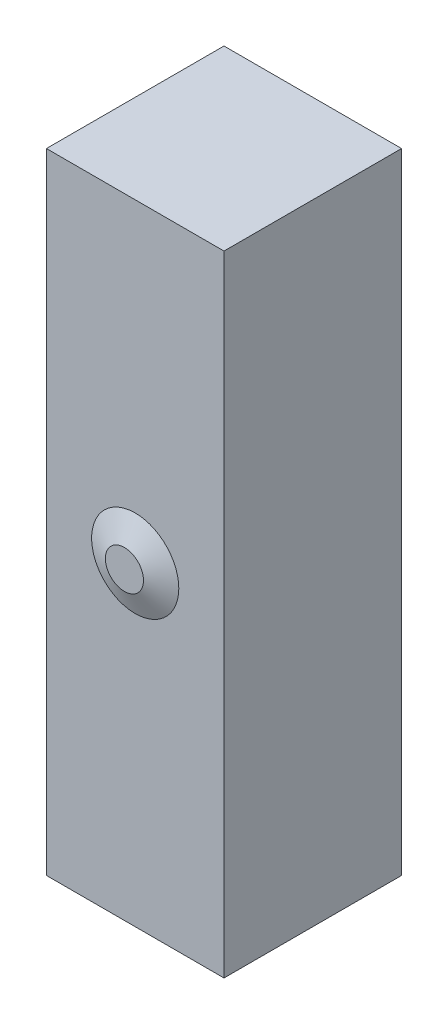
ISO-10303-21;
HEADER;
FILE_DESCRIPTION(('STEP AP214'),'2;1');
FILE_NAME('part.step','',(''),(''),'','','');
FILE_SCHEMA(('AUTOMOTIVE_DESIGN { 1 0 10303 214 1 1 1 1 }'));
ENDSEC;
DATA;
#1=APPLICATION_CONTEXT('core data for automotive mechanical design processes');
#2=APPLICATION_PROTOCOL_DEFINITION('international standard','automotive_design',2000,#1);
#3=PRODUCT_CONTEXT('',#1,'mechanical');
#4=PRODUCT('Part','Part','',(#3));
#5=PRODUCT_RELATED_PRODUCT_CATEGORY('part','',(#4));
#6=PRODUCT_DEFINITION_FORMATION('','',#4);
#7=PRODUCT_DEFINITION_CONTEXT('part definition',#1,'design');
#8=PRODUCT_DEFINITION('design','',#6,#7);
#9=PRODUCT_DEFINITION_SHAPE('','',#8);
#10=(LENGTH_UNIT() NAMED_UNIT(*) SI_UNIT(.MILLI.,.METRE.));
#11=(NAMED_UNIT(*) PLANE_ANGLE_UNIT() SI_UNIT($,.RADIAN.));
#12=(NAMED_UNIT(*) SI_UNIT($,.STERADIAN.) SOLID_ANGLE_UNIT());
#13=UNCERTAINTY_MEASURE_WITH_UNIT(LENGTH_MEASURE(1.E-05),#10,'distance_accuracy_value','');
#14=(GEOMETRIC_REPRESENTATION_CONTEXT(3) GLOBAL_UNCERTAINTY_ASSIGNED_CONTEXT((#13)) GLOBAL_UNIT_ASSIGNED_CONTEXT((#10,
#11,#12)) REPRESENTATION_CONTEXT('',''));
#15=CARTESIAN_POINT('',(0.,0.,0.));
#16=DIRECTION('',(0.,0.,1.));
#17=DIRECTION('',(1.,0.,0.));
#18=AXIS2_PLACEMENT_3D('',#15,#16,#17);
#19=CARTESIAN_POINT('',(8.25,-29.25,16.5));
#20=DIRECTION('',(-1.,0.,0.));
#21=DIRECTION('',(0.,0.,1.));
#22=AXIS2_PLACEMENT_3D('',#19,#20,#21);
#23=PLANE('',#22);
#24=DIRECTION('',(0.,1.,0.));
#25=VECTOR('',#24,1.);
#26=CARTESIAN_POINT('',(8.25,-29.25,0.));
#27=LINE('',#26,#25);
#28=CARTESIAN_POINT('',(8.25,-29.25,0.));
#29=VERTEX_POINT('',#28);
#30=CARTESIAN_POINT('',(8.25,29.25,0.));
#31=VERTEX_POINT('',#30);
#32=EDGE_CURVE('E108',#29,#31,#27,.T.);
#33=ORIENTED_EDGE('',*,*,#32,.T.);
#34=DIRECTION('',(0.,0.,-1.));
#35=VECTOR('',#34,1.);
#36=CARTESIAN_POINT('',(8.25,29.25,16.5));
#37=LINE('',#36,#35);
#38=CARTESIAN_POINT('',(8.25,29.25,16.5));
#39=VERTEX_POINT('',#38);
#40=EDGE_CURVE('E12',#39,#31,#37,.T.);
#41=ORIENTED_EDGE('',*,*,#40,.F.);
#42=DIRECTION('',(0.,1.,0.));
#43=VECTOR('',#42,1.);
#44=CARTESIAN_POINT('',(8.25,-29.25,16.5));
#45=LINE('',#44,#43);
#46=CARTESIAN_POINT('',(8.25,-29.25,16.5));
#47=VERTEX_POINT('',#46);
#48=EDGE_CURVE('E95',#47,#39,#45,.T.);
#49=ORIENTED_EDGE('',*,*,#48,.F.);
#50=DIRECTION('',(0.,0.,-1.));
#51=VECTOR('',#50,1.);
#52=CARTESIAN_POINT('',(8.25,-29.25,16.5));
#53=LINE('',#52,#51);
#54=EDGE_CURVE('E104',#47,#29,#53,.T.);
#55=ORIENTED_EDGE('',*,*,#54,.T.);
#56=EDGE_LOOP('',(#33,#41,#49,#55));
#57=FACE_BOUND('',#56,.T.);
#58=ADVANCED_FACE('F41',(#57),#23,.F.);
#59=CARTESIAN_POINT('',(-8.25,29.25,16.5));
#60=DIRECTION('',(0.,-1.,0.));
#61=DIRECTION('',(0.,0.,-1.));
#62=AXIS2_PLACEMENT_3D('',#59,#60,#61);
#63=PLANE('',#62);
#64=DIRECTION('',(-1.,0.,0.));
#65=VECTOR('',#64,1.);
#66=CARTESIAN_POINT('',(-8.25,29.25,0.));
#67=LINE('',#66,#65);
#68=CARTESIAN_POINT('',(-8.25,29.25,0.));
#69=VERTEX_POINT('',#68);
#70=EDGE_CURVE('E99',#31,#69,#67,.T.);
#71=ORIENTED_EDGE('',*,*,#70,.T.);
#72=DIRECTION('',(0.,0.,-1.));
#73=VECTOR('',#72,1.);
#74=CARTESIAN_POINT('',(-8.25,29.25,16.5));
#75=LINE('',#74,#73);
#76=CARTESIAN_POINT('',(-8.25,29.25,16.5));
#77=VERTEX_POINT('',#76);
#78=EDGE_CURVE('E51',#77,#69,#75,.T.);
#79=ORIENTED_EDGE('',*,*,#78,.F.);
#80=DIRECTION('',(-1.,0.,0.));
#81=VECTOR('',#80,1.);
#82=CARTESIAN_POINT('',(-8.25,29.25,16.5));
#83=LINE('',#82,#81);
#84=EDGE_CURVE('E90',#39,#77,#83,.T.);
#85=ORIENTED_EDGE('',*,*,#84,.F.);
#86=ORIENTED_EDGE('',*,*,#40,.T.);
#87=EDGE_LOOP('',(#71,#79,#85,#86));
#88=FACE_BOUND('',#87,.T.);
#89=ADVANCED_FACE('F98',(#88),#63,.F.);
#90=CARTESIAN_POINT('',(-8.25,-29.25,16.5));
#91=DIRECTION('',(1.,0.,0.));
#92=DIRECTION('',(0.,0.,-1.));
#93=AXIS2_PLACEMENT_3D('',#90,#91,#92);
#94=PLANE('',#93);
#95=DIRECTION('',(0.,-1.,0.));
#96=VECTOR('',#95,1.);
#97=CARTESIAN_POINT('',(-8.25,-29.25,0.));
#98=LINE('',#97,#96);
#99=CARTESIAN_POINT('',(-8.25,-29.25,0.));
#100=VERTEX_POINT('',#99);
#101=EDGE_CURVE('E77',#69,#100,#98,.T.);
#102=ORIENTED_EDGE('',*,*,#101,.T.);
#103=DIRECTION('',(0.,0.,-1.));
#104=VECTOR('',#103,1.);
#105=CARTESIAN_POINT('',(-8.25,-29.25,16.5));
#106=LINE('',#105,#104);
#107=CARTESIAN_POINT('',(-8.25,-29.25,16.5));
#108=VERTEX_POINT('',#107);
#109=EDGE_CURVE('E100',#108,#100,#106,.T.);
#110=ORIENTED_EDGE('',*,*,#109,.F.);
#111=DIRECTION('',(0.,-1.,0.));
#112=VECTOR('',#111,1.);
#113=CARTESIAN_POINT('',(-8.25,-29.25,16.5));
#114=LINE('',#113,#112);
#115=EDGE_CURVE('E93',#77,#108,#114,.T.);
#116=ORIENTED_EDGE('',*,*,#115,.F.);
#117=ORIENTED_EDGE('',*,*,#78,.T.);
#118=EDGE_LOOP('',(#102,#110,#116,#117));
#119=FACE_BOUND('',#118,.T.);
#120=ADVANCED_FACE('F102',(#119),#94,.F.);
#121=CARTESIAN_POINT('',(-8.25,-29.25,16.5));
#122=DIRECTION('',(0.,1.,0.));
#123=DIRECTION('',(0.,0.,1.));
#124=AXIS2_PLACEMENT_3D('',#121,#122,#123);
#125=PLANE('',#124);
#126=DIRECTION('',(1.,0.,0.));
#127=VECTOR('',#126,1.);
#128=CARTESIAN_POINT('',(-8.25,-29.25,0.));
#129=LINE('',#128,#127);
#130=EDGE_CURVE('E83',#100,#29,#129,.T.);
#131=ORIENTED_EDGE('',*,*,#130,.T.);
#132=ORIENTED_EDGE('',*,*,#54,.F.);
#133=DIRECTION('',(1.,0.,0.));
#134=VECTOR('',#133,1.);
#135=CARTESIAN_POINT('',(-8.25,-29.25,16.5));
#136=LINE('',#135,#134);
#137=EDGE_CURVE('E60',#108,#47,#136,.T.);
#138=ORIENTED_EDGE('',*,*,#137,.F.);
#139=ORIENTED_EDGE('',*,*,#109,.T.);
#140=EDGE_LOOP('',(#131,#132,#138,#139));
#141=FACE_BOUND('',#140,.T.);
#142=ADVANCED_FACE('F137',(#141),#125,.F.);
#143=CARTESIAN_POINT('',(0.,0.,16.5));
#144=DIRECTION('',(0.,0.,-1.));
#145=DIRECTION('',(-1.,0.,0.));
#146=AXIS2_PLACEMENT_3D('',#143,#144,#145);
#147=PLANE('',#146);
#148=CARTESIAN_POINT('',(0.,0.,16.5));
#149=DIRECTION('',(0.,0.,1.));
#150=DIRECTION('',(1.,0.,0.));
#151=AXIS2_PLACEMENT_3D('',#148,#149,#150);
#152=CIRCLE('',#151,4.05);
#153=CARTESIAN_POINT('',(4.05,0.,16.5));
#154=VERTEX_POINT('',#153);
#155=EDGE_CURVE('E154',#154,#154,#152,.T.);
#156=ORIENTED_EDGE('',*,*,#155,.F.);
#157=EDGE_LOOP('',(#156));
#158=FACE_BOUND('',#157,.T.);
#159=ORIENTED_EDGE('',*,*,#48,.T.);
#160=ORIENTED_EDGE('',*,*,#84,.T.);
#161=ORIENTED_EDGE('',*,*,#115,.T.);
#162=ORIENTED_EDGE('',*,*,#137,.T.);
#163=EDGE_LOOP('',(#159,#160,#161,#162));
#164=FACE_BOUND('',#163,.T.);
#165=ADVANCED_FACE('F91',(#158,#164),#147,.F.);
#166=CARTESIAN_POINT('',(0.,0.,0.));
#167=DIRECTION('',(0.,0.,-1.));
#168=DIRECTION('',(-1.,0.,0.));
#169=AXIS2_PLACEMENT_3D('',#166,#167,#168);
#170=PLANE('',#169);
#171=ORIENTED_EDGE('',*,*,#32,.F.);
#172=ORIENTED_EDGE('',*,*,#130,.F.);
#173=ORIENTED_EDGE('',*,*,#101,.F.);
#174=ORIENTED_EDGE('',*,*,#70,.F.);
#175=EDGE_LOOP('',(#171,#172,#173,#174));
#176=FACE_BOUND('',#175,.T.);
#177=ADVANCED_FACE('F136',(#176),#170,.T.);
#178=CARTESIAN_POINT('',(0.,0.,17.5));
#179=DIRECTION('',(0.,0.,-1.));
#180=DIRECTION('',(-1.,0.,0.));
#181=AXIS2_PLACEMENT_3D('',#178,#179,#180);
#182=CONICAL_SURFACE('',#181,1.77,1.15746592225557);
#183=ORIENTED_EDGE('',*,*,#155,.T.);
#184=EDGE_LOOP('',(#183));
#185=FACE_BOUND('',#184,.T.);
#186=CARTESIAN_POINT('',(0.,0.,17.5));
#187=DIRECTION('',(0.,0.,1.));
#188=DIRECTION('',(1.,0.,0.));
#189=AXIS2_PLACEMENT_3D('',#186,#187,#188);
#190=CIRCLE('',#189,1.77);
#191=CARTESIAN_POINT('',(1.77,0.,17.5));
#192=VERTEX_POINT('',#191);
#193=EDGE_CURVE('E44',#192,#192,#190,.F.);
#194=ORIENTED_EDGE('',*,*,#193,.T.);
#195=EDGE_LOOP('',(#194));
#196=FACE_BOUND('',#195,.T.);
#197=ADVANCED_FACE('F132',(#185,#196),#182,.T.);
#198=CARTESIAN_POINT('',(0.,0.,17.5));
#199=DIRECTION('',(0.,0.,1.));
#200=DIRECTION('',(1.,0.,0.));
#201=AXIS2_PLACEMENT_3D('',#198,#199,#200);
#202=PLANE('',#201);
#203=ORIENTED_EDGE('',*,*,#193,.F.);
#204=EDGE_LOOP('',(#203));
#205=FACE_BOUND('',#204,.T.);
#206=ADVANCED_FACE('F122',(#205),#202,.T.);
#207=CLOSED_SHELL('',(#58,#89,#120,#142,#165,#177,#197,#206));
#208=MANIFOLD_SOLID_BREP('B2',#207);
#209=ADVANCED_BREP_SHAPE_REPRESENTATION('',(#18,#208),#14);
#210=SHAPE_DEFINITION_REPRESENTATION(#9,#209);
ENDSEC;
END-ISO-10303-21;
